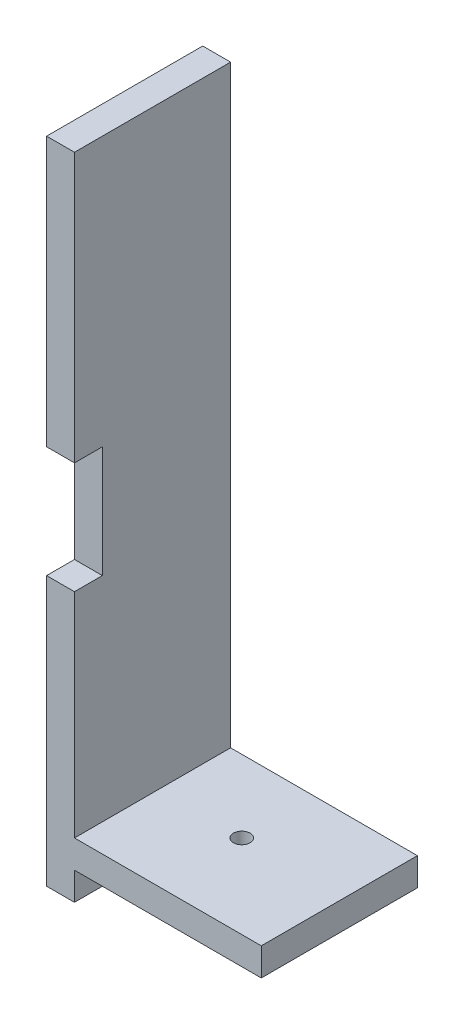
ISO-10303-21;
HEADER;
FILE_DESCRIPTION(('STEP AP214'),'2;1');
FILE_NAME('part.step','',(''),(''),'','','');
FILE_SCHEMA(('AUTOMOTIVE_DESIGN { 1 0 10303 214 1 1 1 1 }'));
ENDSEC;
DATA;
#1=APPLICATION_CONTEXT('core data for automotive mechanical design processes');
#2=APPLICATION_PROTOCOL_DEFINITION('international standard','automotive_design',2000,#1);
#3=PRODUCT_CONTEXT('',#1,'mechanical');
#4=PRODUCT('Part','Part','',(#3));
#5=PRODUCT_RELATED_PRODUCT_CATEGORY('part','',(#4));
#6=PRODUCT_DEFINITION_FORMATION('','',#4);
#7=PRODUCT_DEFINITION_CONTEXT('part definition',#1,'design');
#8=PRODUCT_DEFINITION('design','',#6,#7);
#9=PRODUCT_DEFINITION_SHAPE('','',#8);
#10=(LENGTH_UNIT() NAMED_UNIT(*) SI_UNIT(.MILLI.,.METRE.));
#11=(NAMED_UNIT(*) PLANE_ANGLE_UNIT() SI_UNIT($,.RADIAN.));
#12=(NAMED_UNIT(*) SI_UNIT($,.STERADIAN.) SOLID_ANGLE_UNIT());
#13=UNCERTAINTY_MEASURE_WITH_UNIT(LENGTH_MEASURE(1.E-05),#10,'distance_accuracy_value','');
#14=(GEOMETRIC_REPRESENTATION_CONTEXT(3) GLOBAL_UNCERTAINTY_ASSIGNED_CONTEXT((#13)) GLOBAL_UNIT_ASSIGNED_CONTEXT((#10,
#11,#12)) REPRESENTATION_CONTEXT('',''));
#15=CARTESIAN_POINT('',(0.,0.,0.));
#16=DIRECTION('',(0.,0.,1.));
#17=DIRECTION('',(1.,0.,0.));
#18=AXIS2_PLACEMENT_3D('',#15,#16,#17);
#19=CARTESIAN_POINT('',(-22.451364003671,105.30387717679,28.));
#20=DIRECTION('',(1.,0.,0.));
#21=DIRECTION('',(0.,1.,0.));
#22=AXIS2_PLACEMENT_3D('',#19,#20,#21);
#23=PLANE('',#22);
#24=DIRECTION('',(0.,0.,1.));
#25=VECTOR('',#24,1.);
#26=CARTESIAN_POINT('',(-22.451364003671,37.0538771767903,23.));
#27=LINE('',#26,#25);
#28=CARTESIAN_POINT('',(-22.451364003671,37.0538771767903,23.));
#29=VERTEX_POINT('',#28);
#30=CARTESIAN_POINT('',(-22.451364003671,37.0538771767903,28.));
#31=VERTEX_POINT('',#30);
#32=EDGE_CURVE('E203',#29,#31,#27,.T.);
#33=ORIENTED_EDGE('',*,*,#32,.F.);
#34=DIRECTION('',(0.,1.,0.));
#35=VECTOR('',#34,1.);
#36=CARTESIAN_POINT('',(-22.451364003671,37.0538771767903,23.));
#37=LINE('',#36,#35);
#38=CARTESIAN_POINT('',(-22.451364003671,57.0538771767903,23.));
#39=VERTEX_POINT('',#38);
#40=EDGE_CURVE('E217',#29,#39,#37,.T.);
#41=ORIENTED_EDGE('',*,*,#40,.T.);
#42=DIRECTION('',(0.,0.,1.));
#43=VECTOR('',#42,1.);
#44=CARTESIAN_POINT('',(-22.451364003671,57.0538771767903,23.));
#45=LINE('',#44,#43);
#46=CARTESIAN_POINT('',(-22.451364003671,57.0538771767903,28.));
#47=VERTEX_POINT('',#46);
#48=EDGE_CURVE('E206',#39,#47,#45,.T.);
#49=ORIENTED_EDGE('',*,*,#48,.T.);
#50=DIRECTION('',(0.,-1.,0.));
#51=VECTOR('',#50,1.);
#52=CARTESIAN_POINT('',(-22.451364003671,105.30387717679,28.));
#53=LINE('',#52,#51);
#54=CARTESIAN_POINT('',(-22.451364003671,105.30387717679,28.));
#55=VERTEX_POINT('',#54);
#56=EDGE_CURVE('E200',#55,#47,#53,.T.);
#57=ORIENTED_EDGE('',*,*,#56,.F.);
#58=DIRECTION('',(0.,0.,-1.));
#59=VECTOR('',#58,1.);
#60=CARTESIAN_POINT('',(-22.451364003671,105.30387717679,28.));
#61=LINE('',#60,#59);
#62=CARTESIAN_POINT('',(-22.451364003671,105.30387717679,0.));
#63=VERTEX_POINT('',#62);
#64=EDGE_CURVE('E146',#55,#63,#61,.T.);
#65=ORIENTED_EDGE('',*,*,#64,.T.);
#66=DIRECTION('',(0.,-1.,0.));
#67=VECTOR('',#66,1.);
#68=CARTESIAN_POINT('',(-22.451364003671,105.30387717679,0.));
#69=LINE('',#68,#67);
#70=CARTESIAN_POINT('',(-22.4513640036709,-11.1961228232097,0.));
#71=VERTEX_POINT('',#70);
#72=EDGE_CURVE('E150',#63,#71,#69,.T.);
#73=ORIENTED_EDGE('',*,*,#72,.T.);
#74=DIRECTION('',(0.,0.,-1.));
#75=VECTOR('',#74,1.);
#76=CARTESIAN_POINT('',(-22.4513640036709,-11.1961228232097,28.));
#77=LINE('',#76,#75);
#78=CARTESIAN_POINT('',(-22.4513640036709,-11.1961228232097,28.));
#79=VERTEX_POINT('',#78);
#80=EDGE_CURVE('E11',#79,#71,#77,.T.);
#81=ORIENTED_EDGE('',*,*,#80,.F.);
#82=EDGE_CURVE('E99',#31,#79,#53,.T.);
#83=ORIENTED_EDGE('',*,*,#82,.F.);
#84=EDGE_LOOP('',(#33,#41,#49,#57,#65,#73,#81,#83));
#85=FACE_BOUND('',#84,.T.);
#86=ADVANCED_FACE('F33',(#85),#23,.F.);
#87=CARTESIAN_POINT('',(-17.451364003671,105.30387717679,28.));
#88=DIRECTION('',(-1.,0.,0.));
#89=DIRECTION('',(0.,-1.,0.));
#90=AXIS2_PLACEMENT_3D('',#87,#88,#89);
#91=PLANE('',#90);
#92=DIRECTION('',(0.,0.,1.));
#93=VECTOR('',#92,1.);
#94=CARTESIAN_POINT('',(-17.4513640036709,37.0538771767903,23.));
#95=LINE('',#94,#93);
#96=CARTESIAN_POINT('',(-17.4513640036709,37.0538771767903,23.));
#97=VERTEX_POINT('',#96);
#98=CARTESIAN_POINT('',(-17.4513640036709,37.0538771767903,28.));
#99=VERTEX_POINT('',#98);
#100=EDGE_CURVE('E144',#97,#99,#95,.T.);
#101=ORIENTED_EDGE('',*,*,#100,.T.);
#102=DIRECTION('',(0.,1.,0.));
#103=VECTOR('',#102,1.);
#104=CARTESIAN_POINT('',(-17.4513640036709,95.3038771767903,28.));
#105=LINE('',#104,#103);
#106=CARTESIAN_POINT('',(-17.4513640036709,-1.19612282320975,28.));
#107=VERTEX_POINT('',#106);
#108=EDGE_CURVE('E122',#107,#99,#105,.T.);
#109=ORIENTED_EDGE('',*,*,#108,.F.);
#110=DIRECTION('',(0.,0.,-1.));
#111=VECTOR('',#110,1.);
#112=CARTESIAN_POINT('',(-17.4513640036709,-1.19612282320975,28.));
#113=LINE('',#112,#111);
#114=CARTESIAN_POINT('',(-17.4513640036709,-1.19612282320975,0.));
#115=VERTEX_POINT('',#114);
#116=EDGE_CURVE('E132',#107,#115,#113,.T.);
#117=ORIENTED_EDGE('',*,*,#116,.T.);
#118=DIRECTION('',(0.,1.,0.));
#119=VECTOR('',#118,1.);
#120=CARTESIAN_POINT('',(-17.451364003671,105.30387717679,0.));
#121=LINE('',#120,#119);
#122=CARTESIAN_POINT('',(-17.451364003671,105.30387717679,0.));
#123=VERTEX_POINT('',#122);
#124=EDGE_CURVE('E162',#115,#123,#121,.T.);
#125=ORIENTED_EDGE('',*,*,#124,.T.);
#126=DIRECTION('',(0.,0.,-1.));
#127=VECTOR('',#126,1.);
#128=CARTESIAN_POINT('',(-17.451364003671,105.30387717679,28.));
#129=LINE('',#128,#127);
#130=CARTESIAN_POINT('',(-17.451364003671,105.30387717679,28.));
#131=VERTEX_POINT('',#130);
#132=EDGE_CURVE('E138',#131,#123,#129,.T.);
#133=ORIENTED_EDGE('',*,*,#132,.F.);
#134=CARTESIAN_POINT('',(-17.4513640036709,57.0538771767903,28.));
#135=VERTEX_POINT('',#134);
#136=EDGE_CURVE('E128',#135,#131,#105,.T.);
#137=ORIENTED_EDGE('',*,*,#136,.F.);
#138=DIRECTION('',(0.,0.,1.));
#139=VECTOR('',#138,1.);
#140=CARTESIAN_POINT('',(-17.4513640036709,57.0538771767903,23.));
#141=LINE('',#140,#139);
#142=CARTESIAN_POINT('',(-17.4513640036709,57.0538771767903,23.));
#143=VERTEX_POINT('',#142);
#144=EDGE_CURVE('E48',#143,#135,#141,.T.);
#145=ORIENTED_EDGE('',*,*,#144,.F.);
#146=DIRECTION('',(0.,-1.,0.));
#147=VECTOR('',#146,1.);
#148=CARTESIAN_POINT('',(-17.4513640036709,37.0538771767903,23.));
#149=LINE('',#148,#147);
#150=EDGE_CURVE('E213',#143,#97,#149,.T.);
#151=ORIENTED_EDGE('',*,*,#150,.T.);
#152=EDGE_LOOP('',(#101,#109,#117,#125,#133,#137,#145,#151));
#153=FACE_BOUND('',#152,.T.);
#154=ADVANCED_FACE('F141',(#153),#91,.F.);
#155=CARTESIAN_POINT('',(0.,0.,28.));
#156=DIRECTION('',(0.,0.,1.));
#157=DIRECTION('',(1.,0.,0.));
#158=AXIS2_PLACEMENT_3D('',#155,#156,#157);
#159=PLANE('',#158);
#160=ORIENTED_EDGE('',*,*,#108,.T.);
#161=DIRECTION('',(-1.,0.,0.));
#162=VECTOR('',#161,1.);
#163=CARTESIAN_POINT('',(-17.4513640036709,37.0538771767903,28.));
#164=LINE('',#163,#162);
#165=EDGE_CURVE('E214',#99,#31,#164,.T.);
#166=ORIENTED_EDGE('',*,*,#165,.T.);
#167=ORIENTED_EDGE('',*,*,#82,.T.);
#168=DIRECTION('',(1.,0.,0.));
#169=VECTOR('',#168,1.);
#170=CARTESIAN_POINT('',(-22.4513640036709,-11.1961228232097,28.));
#171=LINE('',#170,#169);
#172=CARTESIAN_POINT('',(-17.4513640036709,-11.1961228232097,28.));
#173=VERTEX_POINT('',#172);
#174=EDGE_CURVE('E198',#79,#173,#171,.T.);
#175=ORIENTED_EDGE('',*,*,#174,.T.);
#176=DIRECTION('',(0.,1.,0.));
#177=VECTOR('',#176,1.);
#178=CARTESIAN_POINT('',(-17.4513640036709,-6.19612282320975,28.));
#179=LINE('',#178,#177);
#180=CARTESIAN_POINT('',(-17.4513640036709,-6.19612282320975,28.));
#181=VERTEX_POINT('',#180);
#182=EDGE_CURVE('E181',#173,#181,#179,.T.);
#183=ORIENTED_EDGE('',*,*,#182,.T.);
#184=DIRECTION('',(1.,0.,0.));
#185=VECTOR('',#184,1.);
#186=CARTESIAN_POINT('',(-17.4513640036709,-6.19612282320975,28.));
#187=LINE('',#186,#185);
#188=CARTESIAN_POINT('',(16.0486359963291,-6.19612282320975,28.));
#189=VERTEX_POINT('',#188);
#190=EDGE_CURVE('E194',#181,#189,#187,.T.);
#191=ORIENTED_EDGE('',*,*,#190,.T.);
#192=DIRECTION('',(0.,1.,0.));
#193=VECTOR('',#192,1.);
#194=CARTESIAN_POINT('',(16.0486359963291,-6.19612282320975,28.));
#195=LINE('',#194,#193);
#196=CARTESIAN_POINT('',(16.0486359963291,-1.19612282320975,28.));
#197=VERTEX_POINT('',#196);
#198=EDGE_CURVE('E124',#189,#197,#195,.T.);
#199=ORIENTED_EDGE('',*,*,#198,.T.);
#200=DIRECTION('',(-1.,0.,0.));
#201=VECTOR('',#200,1.);
#202=CARTESIAN_POINT('',(-17.4513640036709,-1.19612282320975,28.));
#203=LINE('',#202,#201);
#204=EDGE_CURVE('E117',#197,#107,#203,.T.);
#205=ORIENTED_EDGE('',*,*,#204,.T.);
#206=EDGE_LOOP('',(#160,#166,#167,#175,#183,#191,#199,#205));
#207=FACE_BOUND('',#206,.T.);
#208=ADVANCED_FACE('F119',(#207),#159,.T.);
#209=ORIENTED_EDGE('',*,*,#56,.T.);
#210=DIRECTION('',(1.,0.,0.));
#211=VECTOR('',#210,1.);
#212=CARTESIAN_POINT('',(-17.4513640036709,57.0538771767903,28.));
#213=LINE('',#212,#211);
#214=EDGE_CURVE('E211',#47,#135,#213,.T.);
#215=ORIENTED_EDGE('',*,*,#214,.T.);
#216=ORIENTED_EDGE('',*,*,#136,.T.);
#217=DIRECTION('',(-1.,0.,0.));
#218=VECTOR('',#217,1.);
#219=CARTESIAN_POINT('',(-22.451364003671,105.30387717679,28.));
#220=LINE('',#219,#218);
#221=EDGE_CURVE('E57',#131,#55,#220,.T.);
#222=ORIENTED_EDGE('',*,*,#221,.T.);
#223=EDGE_LOOP('',(#209,#215,#216,#222));
#224=FACE_BOUND('',#223,.T.);
#225=ADVANCED_FACE('F269',(#224),#159,.T.);
#226=CARTESIAN_POINT('',(-22.4513640036709,-11.1961228232097,28.));
#227=DIRECTION('',(0.,1.,0.));
#228=DIRECTION('',(0.,0.,1.));
#229=AXIS2_PLACEMENT_3D('',#226,#227,#228);
#230=PLANE('',#229);
#231=DIRECTION('',(1.,0.,0.));
#232=VECTOR('',#231,1.);
#233=CARTESIAN_POINT('',(-22.4513640036709,-11.1961228232097,0.));
#234=LINE('',#233,#232);
#235=CARTESIAN_POINT('',(-17.4513640036709,-11.1961228232097,0.));
#236=VERTEX_POINT('',#235);
#237=EDGE_CURVE('E153',#71,#236,#234,.T.);
#238=ORIENTED_EDGE('',*,*,#237,.T.);
#239=DIRECTION('',(0.,0.,-1.));
#240=VECTOR('',#239,1.);
#241=CARTESIAN_POINT('',(-17.4513640036709,-11.1961228232097,28.));
#242=LINE('',#241,#240);
#243=EDGE_CURVE('E41',#173,#236,#242,.T.);
#244=ORIENTED_EDGE('',*,*,#243,.F.);
#245=ORIENTED_EDGE('',*,*,#174,.F.);
#246=ORIENTED_EDGE('',*,*,#80,.T.);
#247=EDGE_LOOP('',(#238,#244,#245,#246));
#248=FACE_BOUND('',#247,.T.);
#249=ADVANCED_FACE('F288',(#248),#230,.F.);
#250=CARTESIAN_POINT('',(-17.4513640036709,-6.19612282320975,28.));
#251=DIRECTION('',(-1.,0.,0.));
#252=DIRECTION('',(0.,-1.,0.));
#253=AXIS2_PLACEMENT_3D('',#250,#251,#252);
#254=PLANE('',#253);
#255=DIRECTION('',(0.,1.,0.));
#256=VECTOR('',#255,1.);
#257=CARTESIAN_POINT('',(-17.4513640036709,-6.19612282320975,0.));
#258=LINE('',#257,#256);
#259=CARTESIAN_POINT('',(-17.4513640036709,-6.19612282320975,0.));
#260=VERTEX_POINT('',#259);
#261=EDGE_CURVE('E155',#236,#260,#258,.T.);
#262=ORIENTED_EDGE('',*,*,#261,.T.);
#263=DIRECTION('',(0.,0.,-1.));
#264=VECTOR('',#263,1.);
#265=CARTESIAN_POINT('',(-17.4513640036709,-6.19612282320975,28.));
#266=LINE('',#265,#264);
#267=EDGE_CURVE('E171',#181,#260,#266,.T.);
#268=ORIENTED_EDGE('',*,*,#267,.F.);
#269=ORIENTED_EDGE('',*,*,#182,.F.);
#270=ORIENTED_EDGE('',*,*,#243,.T.);
#271=EDGE_LOOP('',(#262,#268,#269,#270));
#272=FACE_BOUND('',#271,.T.);
#273=ADVANCED_FACE('F179',(#272),#254,.F.);
#274=CARTESIAN_POINT('',(-17.4513640036709,-6.19612282320975,28.));
#275=DIRECTION('',(0.,1.,0.));
#276=DIRECTION('',(-1.,0.,0.));
#277=AXIS2_PLACEMENT_3D('',#274,#275,#276);
#278=PLANE('',#277);
#279=CARTESIAN_POINT('',(-2.45136400367091,-6.19612282320975,13.));
#280=DIRECTION('',(0.,-1.,0.));
#281=DIRECTION('',(1.,0.,0.));
#282=AXIS2_PLACEMENT_3D('',#279,#280,#281);
#283=CIRCLE('',#282,1.5);
#284=CARTESIAN_POINT('',(-0.951364003670911,-6.19612282320975,13.));
#285=VERTEX_POINT('',#284);
#286=EDGE_CURVE('E224',#285,#285,#283,.T.);
#287=ORIENTED_EDGE('',*,*,#286,.F.);
#288=EDGE_LOOP('',(#287));
#289=FACE_BOUND('',#288,.T.);
#290=DIRECTION('',(1.,0.,0.));
#291=VECTOR('',#290,1.);
#292=CARTESIAN_POINT('',(-17.4513640036709,-6.19612282320975,0.));
#293=LINE('',#292,#291);
#294=CARTESIAN_POINT('',(16.0486359963291,-6.19612282320975,0.));
#295=VERTEX_POINT('',#294);
#296=EDGE_CURVE('E157',#260,#295,#293,.T.);
#297=ORIENTED_EDGE('',*,*,#296,.T.);
#298=DIRECTION('',(0.,0.,-1.));
#299=VECTOR('',#298,1.);
#300=CARTESIAN_POINT('',(16.0486359963291,-6.19612282320975,28.));
#301=LINE('',#300,#299);
#302=EDGE_CURVE('E168',#189,#295,#301,.T.);
#303=ORIENTED_EDGE('',*,*,#302,.F.);
#304=ORIENTED_EDGE('',*,*,#190,.F.);
#305=ORIENTED_EDGE('',*,*,#267,.T.);
#306=EDGE_LOOP('',(#297,#303,#304,#305));
#307=FACE_BOUND('',#306,.T.);
#308=ADVANCED_FACE('F190',(#289,#307),#278,.F.);
#309=CARTESIAN_POINT('',(16.0486359963291,-6.19612282320975,28.));
#310=DIRECTION('',(-1.,0.,0.));
#311=DIRECTION('',(0.,-1.,0.));
#312=AXIS2_PLACEMENT_3D('',#309,#310,#311);
#313=PLANE('',#312);
#314=DIRECTION('',(0.,1.,0.));
#315=VECTOR('',#314,1.);
#316=CARTESIAN_POINT('',(16.0486359963291,-6.19612282320975,0.));
#317=LINE('',#316,#315);
#318=CARTESIAN_POINT('',(16.0486359963291,-1.19612282320975,0.));
#319=VERTEX_POINT('',#318);
#320=EDGE_CURVE('E159',#295,#319,#317,.T.);
#321=ORIENTED_EDGE('',*,*,#320,.T.);
#322=DIRECTION('',(0.,0.,-1.));
#323=VECTOR('',#322,1.);
#324=CARTESIAN_POINT('',(16.0486359963291,-1.19612282320975,28.));
#325=LINE('',#324,#323);
#326=EDGE_CURVE('E137',#197,#319,#325,.T.);
#327=ORIENTED_EDGE('',*,*,#326,.F.);
#328=ORIENTED_EDGE('',*,*,#198,.F.);
#329=ORIENTED_EDGE('',*,*,#302,.T.);
#330=EDGE_LOOP('',(#321,#327,#328,#329));
#331=FACE_BOUND('',#330,.T.);
#332=ADVANCED_FACE('F193',(#331),#313,.F.);
#333=CARTESIAN_POINT('',(-17.4513640036709,-1.19612282320975,28.));
#334=DIRECTION('',(0.,-1.,0.));
#335=DIRECTION('',(0.,0.,-1.));
#336=AXIS2_PLACEMENT_3D('',#333,#334,#335);
#337=PLANE('',#336);
#338=CARTESIAN_POINT('',(-2.45136400367091,-1.19612282320974,13.));
#339=DIRECTION('',(0.,-1.,0.));
#340=DIRECTION('',(0.,0.,-1.));
#341=AXIS2_PLACEMENT_3D('',#338,#339,#340);
#342=CIRCLE('',#341,1.5);
#343=CARTESIAN_POINT('',(-2.45136400367091,-1.19612282320974,11.5));
#344=VERTEX_POINT('',#343);
#345=EDGE_CURVE('E36',#344,#344,#342,.T.);
#346=ORIENTED_EDGE('',*,*,#345,.T.);
#347=EDGE_LOOP('',(#346));
#348=FACE_BOUND('',#347,.T.);
#349=DIRECTION('',(-1.,0.,0.));
#350=VECTOR('',#349,1.);
#351=CARTESIAN_POINT('',(-17.4513640036709,-1.19612282320975,0.));
#352=LINE('',#351,#350);
#353=EDGE_CURVE('E135',#319,#115,#352,.T.);
#354=ORIENTED_EDGE('',*,*,#353,.T.);
#355=ORIENTED_EDGE('',*,*,#116,.F.);
#356=ORIENTED_EDGE('',*,*,#204,.F.);
#357=ORIENTED_EDGE('',*,*,#326,.T.);
#358=EDGE_LOOP('',(#354,#355,#356,#357));
#359=FACE_BOUND('',#358,.T.);
#360=ADVANCED_FACE('F133',(#348,#359),#337,.F.);
#361=CARTESIAN_POINT('',(-22.451364003671,105.30387717679,28.));
#362=DIRECTION('',(0.,-1.,0.));
#363=DIRECTION('',(0.,0.,-1.));
#364=AXIS2_PLACEMENT_3D('',#361,#362,#363);
#365=PLANE('',#364);
#366=DIRECTION('',(-1.,0.,0.));
#367=VECTOR('',#366,1.);
#368=CARTESIAN_POINT('',(-22.451364003671,105.30387717679,0.));
#369=LINE('',#368,#367);
#370=EDGE_CURVE('E90',#123,#63,#369,.T.);
#371=ORIENTED_EDGE('',*,*,#370,.T.);
#372=ORIENTED_EDGE('',*,*,#64,.F.);
#373=ORIENTED_EDGE('',*,*,#221,.F.);
#374=ORIENTED_EDGE('',*,*,#132,.T.);
#375=EDGE_LOOP('',(#371,#372,#373,#374));
#376=FACE_BOUND('',#375,.T.);
#377=ADVANCED_FACE('F271',(#376),#365,.F.);
#378=CARTESIAN_POINT('',(0.,0.,0.));
#379=DIRECTION('',(0.,0.,1.));
#380=DIRECTION('',(1.,0.,0.));
#381=AXIS2_PLACEMENT_3D('',#378,#379,#380);
#382=PLANE('',#381);
#383=ORIENTED_EDGE('',*,*,#72,.F.);
#384=ORIENTED_EDGE('',*,*,#370,.F.);
#385=ORIENTED_EDGE('',*,*,#124,.F.);
#386=ORIENTED_EDGE('',*,*,#353,.F.);
#387=ORIENTED_EDGE('',*,*,#320,.F.);
#388=ORIENTED_EDGE('',*,*,#296,.F.);
#389=ORIENTED_EDGE('',*,*,#261,.F.);
#390=ORIENTED_EDGE('',*,*,#237,.F.);
#391=EDGE_LOOP('',(#383,#384,#385,#386,#387,#388,#389,#390));
#392=FACE_BOUND('',#391,.T.);
#393=ADVANCED_FACE('F186',(#392),#382,.F.);
#394=CARTESIAN_POINT('',(-17.4513640036709,37.0538771767903,23.));
#395=DIRECTION('',(0.,1.,0.));
#396=DIRECTION('',(0.,0.,1.));
#397=AXIS2_PLACEMENT_3D('',#394,#395,#396);
#398=PLANE('',#397);
#399=ORIENTED_EDGE('',*,*,#165,.F.);
#400=ORIENTED_EDGE('',*,*,#100,.F.);
#401=DIRECTION('',(-1.,0.,0.));
#402=VECTOR('',#401,1.);
#403=CARTESIAN_POINT('',(-17.4513640036709,37.0538771767903,23.));
#404=LINE('',#403,#402);
#405=EDGE_CURVE('E220',#97,#29,#404,.T.);
#406=ORIENTED_EDGE('',*,*,#405,.T.);
#407=ORIENTED_EDGE('',*,*,#32,.T.);
#408=EDGE_LOOP('',(#399,#400,#406,#407));
#409=FACE_BOUND('',#408,.T.);
#410=ADVANCED_FACE('F258',(#409),#398,.T.);
#411=CARTESIAN_POINT('',(-17.4513640036709,57.0538771767903,23.));
#412=DIRECTION('',(0.,-1.,0.));
#413=DIRECTION('',(0.,0.,-1.));
#414=AXIS2_PLACEMENT_3D('',#411,#412,#413);
#415=PLANE('',#414);
#416=ORIENTED_EDGE('',*,*,#214,.F.);
#417=ORIENTED_EDGE('',*,*,#48,.F.);
#418=DIRECTION('',(1.,0.,0.));
#419=VECTOR('',#418,1.);
#420=CARTESIAN_POINT('',(-17.4513640036709,57.0538771767903,23.));
#421=LINE('',#420,#419);
#422=EDGE_CURVE('E210',#39,#143,#421,.T.);
#423=ORIENTED_EDGE('',*,*,#422,.T.);
#424=ORIENTED_EDGE('',*,*,#144,.T.);
#425=EDGE_LOOP('',(#416,#417,#423,#424));
#426=FACE_BOUND('',#425,.T.);
#427=ADVANCED_FACE('F239',(#426),#415,.T.);
#428=CARTESIAN_POINT('',(0.,0.,23.));
#429=DIRECTION('',(0.,0.,1.));
#430=DIRECTION('',(1.,0.,0.));
#431=AXIS2_PLACEMENT_3D('',#428,#429,#430);
#432=PLANE('',#431);
#433=ORIENTED_EDGE('',*,*,#150,.F.);
#434=ORIENTED_EDGE('',*,*,#422,.F.);
#435=ORIENTED_EDGE('',*,*,#40,.F.);
#436=ORIENTED_EDGE('',*,*,#405,.F.);
#437=EDGE_LOOP('',(#433,#434,#435,#436));
#438=FACE_BOUND('',#437,.T.);
#439=ADVANCED_FACE('F234',(#438),#432,.T.);
#440=CARTESIAN_POINT('',(-2.4513640036709,105.30387717679,13.));
#441=DIRECTION('',(0.,-1.,0.));
#442=DIRECTION('',(1.,0.,0.));
#443=AXIS2_PLACEMENT_3D('',#440,#441,#442);
#444=CYLINDRICAL_SURFACE('',#443,1.5);
#445=ORIENTED_EDGE('',*,*,#286,.T.);
#446=EDGE_LOOP('',(#445));
#447=FACE_BOUND('',#446,.T.);
#448=ORIENTED_EDGE('',*,*,#345,.F.);
#449=EDGE_LOOP('',(#448));
#450=FACE_BOUND('',#449,.T.);
#451=ADVANCED_FACE('F232',(#447,#450),#444,.F.);
#452=CLOSED_SHELL('',(#86,#154,#208,#225,#249,#273,#308,#332,#360,#377,#393,#410,#427,#439,#451));
#453=MANIFOLD_SOLID_BREP('B2',#452);
#454=ADVANCED_BREP_SHAPE_REPRESENTATION('',(#18,#453),#14);
#455=SHAPE_DEFINITION_REPRESENTATION(#9,#454);
ENDSEC;
END-ISO-10303-21;
